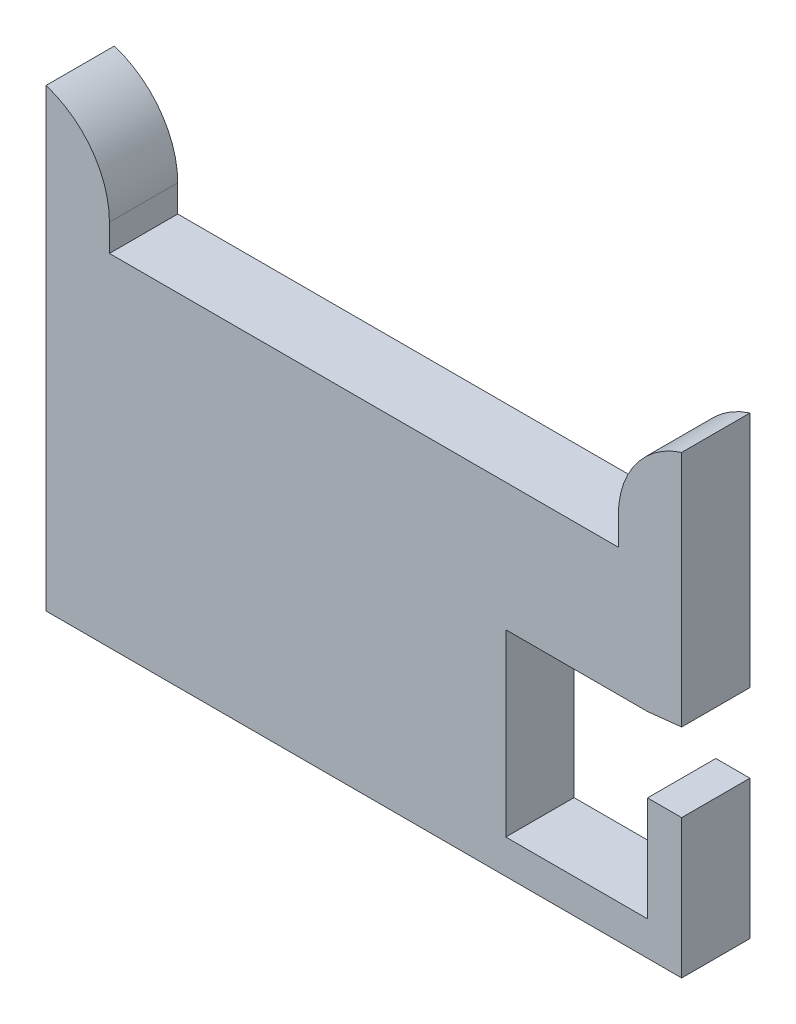
ISO-10303-21;
HEADER;
FILE_DESCRIPTION(('STEP AP214'),'2;1');
FILE_NAME('part.step','',(''),(''),'','','');
FILE_SCHEMA(('AUTOMOTIVE_DESIGN { 1 0 10303 214 1 1 1 1 }'));
ENDSEC;
DATA;
#1=APPLICATION_CONTEXT('core data for automotive mechanical design processes');
#2=APPLICATION_PROTOCOL_DEFINITION('international standard','automotive_design',2000,#1);
#3=PRODUCT_CONTEXT('',#1,'mechanical');
#4=PRODUCT('Part','Part','',(#3));
#5=PRODUCT_RELATED_PRODUCT_CATEGORY('part','',(#4));
#6=PRODUCT_DEFINITION_FORMATION('','',#4);
#7=PRODUCT_DEFINITION_CONTEXT('part definition',#1,'design');
#8=PRODUCT_DEFINITION('design','',#6,#7);
#9=PRODUCT_DEFINITION_SHAPE('','',#8);
#10=(LENGTH_UNIT() NAMED_UNIT(*) SI_UNIT(.MILLI.,.METRE.));
#11=(NAMED_UNIT(*) PLANE_ANGLE_UNIT() SI_UNIT($,.RADIAN.));
#12=(NAMED_UNIT(*) SI_UNIT($,.STERADIAN.) SOLID_ANGLE_UNIT());
#13=UNCERTAINTY_MEASURE_WITH_UNIT(LENGTH_MEASURE(1.E-05),#10,'distance_accuracy_value','');
#14=(GEOMETRIC_REPRESENTATION_CONTEXT(3) GLOBAL_UNCERTAINTY_ASSIGNED_CONTEXT((#13)) GLOBAL_UNIT_ASSIGNED_CONTEXT((#10,
#11,#12)) REPRESENTATION_CONTEXT('',''));
#15=CARTESIAN_POINT('',(0.,0.,0.));
#16=DIRECTION('',(0.,0.,1.));
#17=DIRECTION('',(1.,0.,0.));
#18=AXIS2_PLACEMENT_3D('',#15,#16,#17);
#19=CARTESIAN_POINT('',(27.9278685437168,-36.6169154228856,6.));
#20=DIRECTION('',(-1.,0.,0.));
#21=DIRECTION('',(0.,0.,1.));
#22=AXIS2_PLACEMENT_3D('',#19,#20,#21);
#23=PLANE('',#22);
#24=DIRECTION('',(0.,0.,-1.));
#25=VECTOR('',#24,1.);
#26=CARTESIAN_POINT('',(27.9278685437168,-24.4102266627806,99.7034599579363));
#27=LINE('',#26,#25);
#28=CARTESIAN_POINT('',(27.9278685437168,-24.4102266627806,6.00000000000001));
#29=VERTEX_POINT('',#28);
#30=CARTESIAN_POINT('',(27.9278685437168,-24.4102266627806,0.));
#31=VERTEX_POINT('',#30);
#32=EDGE_CURVE('E55',#29,#31,#27,.T.);
#33=ORIENTED_EDGE('',*,*,#32,.F.);
#34=DIRECTION('',(0.,1.,0.));
#35=VECTOR('',#34,1.);
#36=CARTESIAN_POINT('',(27.9278685437168,-36.6169154228856,6.));
#37=LINE('',#36,#35);
#38=CARTESIAN_POINT('',(27.9278685437168,-36.6169154228856,6.));
#39=VERTEX_POINT('',#38);
#40=EDGE_CURVE('E174',#39,#29,#37,.T.);
#41=ORIENTED_EDGE('',*,*,#40,.F.);
#42=DIRECTION('',(0.,0.,-1.));
#43=VECTOR('',#42,1.);
#44=CARTESIAN_POINT('',(27.9278685437168,-36.6169154228856,6.));
#45=LINE('',#44,#43);
#46=CARTESIAN_POINT('',(27.9278685437168,-36.6169154228856,0.));
#47=VERTEX_POINT('',#46);
#48=EDGE_CURVE('E231',#39,#47,#45,.T.);
#49=ORIENTED_EDGE('',*,*,#48,.T.);
#50=DIRECTION('',(0.,1.,0.));
#51=VECTOR('',#50,1.);
#52=CARTESIAN_POINT('',(27.9278685437168,-36.6169154228856,0.));
#53=LINE('',#52,#51);
#54=EDGE_CURVE('E204',#47,#31,#53,.T.);
#55=ORIENTED_EDGE('',*,*,#54,.T.);
#56=EDGE_LOOP('',(#33,#41,#49,#55));
#57=FACE_BOUND('',#56,.T.);
#58=ADVANCED_FACE('F39',(#57),#23,.F.);
#59=CARTESIAN_POINT('',(0.,0.,6.));
#60=DIRECTION('',(0.,0.,-1.));
#61=DIRECTION('',(-1.,0.,0.));
#62=AXIS2_PLACEMENT_3D('',#59,#60,#61);
#63=PLANE('',#62);
#64=DIRECTION('',(1.,0.,0.));
#65=VECTOR('',#64,1.);
#66=CARTESIAN_POINT('',(0.,-24.4102266627806,6.));
#67=LINE('',#66,#65);
#68=CARTESIAN_POINT('',(24.9278685437168,-24.4102266627806,6.00000000000001));
#69=VERTEX_POINT('',#68);
#70=EDGE_CURVE('E167',#69,#29,#67,.T.);
#71=ORIENTED_EDGE('',*,*,#70,.F.);
#72=DIRECTION('',(0.,1.,0.));
#73=VECTOR('',#72,1.);
#74=CARTESIAN_POINT('',(24.9278685437168,-17.8382437333653,6.));
#75=LINE('',#74,#73);
#76=CARTESIAN_POINT('',(24.9278685437168,-33.6169154228856,6.));
#77=VERTEX_POINT('',#76);
#78=EDGE_CURVE('E283',#77,#69,#75,.T.);
#79=ORIENTED_EDGE('',*,*,#78,.F.);
#80=DIRECTION('',(1.,0.,0.));
#81=VECTOR('',#80,1.);
#82=CARTESIAN_POINT('',(12.4710296326959,-33.6169154228856,6.));
#83=LINE('',#82,#81);
#84=CARTESIAN_POINT('',(12.4710296326959,-33.6169154228856,6.));
#85=VERTEX_POINT('',#84);
#86=EDGE_CURVE('E276',#85,#77,#83,.T.);
#87=ORIENTED_EDGE('',*,*,#86,.F.);
#88=DIRECTION('',(0.,-1.,0.));
#89=VECTOR('',#88,1.);
#90=CARTESIAN_POINT('',(12.4710296326959,-17.8382437333653,6.));
#91=LINE('',#90,#89);
#92=CARTESIAN_POINT('',(12.4710296326959,-17.8382437333653,6.));
#93=VERTEX_POINT('',#92);
#94=EDGE_CURVE('E289',#93,#85,#91,.T.);
#95=ORIENTED_EDGE('',*,*,#94,.F.);
#96=DIRECTION('',(-1.,0.,0.));
#97=VECTOR('',#96,1.);
#98=CARTESIAN_POINT('',(12.4710296326959,-17.8382437333653,6.));
#99=LINE('',#98,#97);
#100=CARTESIAN_POINT('',(24.9278685437168,-17.8382437333653,6.00000000000001));
#101=VERTEX_POINT('',#100);
#102=EDGE_CURVE('E165',#101,#93,#99,.T.);
#103=ORIENTED_EDGE('',*,*,#102,.F.);
#104=DIRECTION('',(-0.994313876279329,-0.10648903905274,0.));
#105=VECTOR('',#104,1.);
#106=CARTESIAN_POINT('',(2.17145612259514,-20.2754102547468,6.));
#107=LINE('',#106,#105);
#108=CARTESIAN_POINT('',(27.9278685437168,-17.5169496985745,6.00000000000001));
#109=VERTEX_POINT('',#108);
#110=EDGE_CURVE('E148',#109,#101,#107,.T.);
#111=ORIENTED_EDGE('',*,*,#110,.F.);
#112=CARTESIAN_POINT('',(27.9278685437168,3.38308457711443,6.));
#113=VERTEX_POINT('',#112);
#114=EDGE_CURVE('E161',#109,#113,#37,.T.);
#115=ORIENTED_EDGE('',*,*,#114,.T.);
#116=CARTESIAN_POINT('',(30.3557292402342,-4.23961130021834,6.));
#117=DIRECTION('',(0.,0.,-1.));
#118=DIRECTION('',(-1.,0.,0.));
#119=AXIS2_PLACEMENT_3D('',#116,#117,#118);
#120=CIRCLE('',#119,8.);
#121=CARTESIAN_POINT('',(22.3557292402342,-4.23961130021835,6.));
#122=VERTEX_POINT('',#121);
#123=EDGE_CURVE('E256',#113,#122,#120,.F.);
#124=ORIENTED_EDGE('',*,*,#123,.T.);
#125=DIRECTION('',(0.,-1.,0.));
#126=VECTOR('',#125,1.);
#127=CARTESIAN_POINT('',(22.3557292402341,3.38308457711443,6.));
#128=LINE('',#127,#126);
#129=CARTESIAN_POINT('',(22.3557292402342,-6.61691542288557,6.));
#130=VERTEX_POINT('',#129);
#131=EDGE_CURVE('E180',#122,#130,#128,.T.);
#132=ORIENTED_EDGE('',*,*,#131,.T.);
#133=DIRECTION('',(-1.,0.,0.));
#134=VECTOR('',#133,1.);
#135=CARTESIAN_POINT('',(22.3557292402342,-6.61691542288557,6.));
#136=LINE('',#135,#134);
#137=CARTESIAN_POINT('',(-22.3557292402341,-6.61691542288557,6.));
#138=VERTEX_POINT('',#137);
#139=EDGE_CURVE('E187',#130,#138,#136,.T.);
#140=ORIENTED_EDGE('',*,*,#139,.T.);
#141=DIRECTION('',(0.,1.,0.));
#142=VECTOR('',#141,1.);
#143=CARTESIAN_POINT('',(-22.3557292402341,3.38308457711443,6.));
#144=LINE('',#143,#142);
#145=CARTESIAN_POINT('',(-22.3557292402341,-4.23961130021835,6.));
#146=VERTEX_POINT('',#145);
#147=EDGE_CURVE('E190',#138,#146,#144,.T.);
#148=ORIENTED_EDGE('',*,*,#147,.T.);
#149=CARTESIAN_POINT('',(-30.3557292402341,-4.23961130021835,6.));
#150=DIRECTION('',(0.,0.,-1.));
#151=DIRECTION('',(-1.,0.,0.));
#152=AXIS2_PLACEMENT_3D('',#149,#150,#151);
#153=CIRCLE('',#152,8.);
#154=CARTESIAN_POINT('',(-27.9278685437168,3.38308457711443,6.));
#155=VERTEX_POINT('',#154);
#156=EDGE_CURVE('E245',#146,#155,#153,.F.);
#157=ORIENTED_EDGE('',*,*,#156,.T.);
#158=DIRECTION('',(0.,-1.,0.));
#159=VECTOR('',#158,1.);
#160=CARTESIAN_POINT('',(-27.9278685437168,-36.6169154228856,6.));
#161=LINE('',#160,#159);
#162=CARTESIAN_POINT('',(-27.9278685437168,-36.6169154228856,6.));
#163=VERTEX_POINT('',#162);
#164=EDGE_CURVE('E181',#155,#163,#161,.T.);
#165=ORIENTED_EDGE('',*,*,#164,.T.);
#166=DIRECTION('',(1.,0.,0.));
#167=VECTOR('',#166,1.);
#168=CARTESIAN_POINT('',(-27.9278685437168,-36.6169154228856,6.));
#169=LINE('',#168,#167);
#170=EDGE_CURVE('E175',#163,#39,#169,.T.);
#171=ORIENTED_EDGE('',*,*,#170,.T.);
#172=ORIENTED_EDGE('',*,*,#40,.T.);
#173=EDGE_LOOP('',(#71,#79,#87,#95,#103,#111,#115,#124,#132,#140,#148,#157,#165,#171,#172));
#174=FACE_BOUND('',#173,.T.);
#175=ADVANCED_FACE('F160',(#174),#63,.F.);
#176=CARTESIAN_POINT('',(0.,0.,0.));
#177=DIRECTION('',(0.,0.,-1.));
#178=DIRECTION('',(-1.,0.,0.));
#179=AXIS2_PLACEMENT_3D('',#176,#177,#178);
#180=PLANE('',#179);
#181=DIRECTION('',(0.,1.,0.));
#182=VECTOR('',#181,1.);
#183=CARTESIAN_POINT('',(24.9278685437168,-17.8382437333653,0.));
#184=LINE('',#183,#182);
#185=CARTESIAN_POINT('',(24.9278685437168,-33.6169154228856,0.));
#186=VERTEX_POINT('',#185);
#187=CARTESIAN_POINT('',(24.9278685437168,-24.4102266627806,0.));
#188=VERTEX_POINT('',#187);
#189=EDGE_CURVE('E270',#186,#188,#184,.T.);
#190=ORIENTED_EDGE('',*,*,#189,.T.);
#191=DIRECTION('',(1.,0.,0.));
#192=VECTOR('',#191,1.);
#193=CARTESIAN_POINT('',(0.,-24.4102266627806,0.));
#194=LINE('',#193,#192);
#195=EDGE_CURVE('E11',#188,#31,#194,.T.);
#196=ORIENTED_EDGE('',*,*,#195,.T.);
#197=ORIENTED_EDGE('',*,*,#54,.F.);
#198=DIRECTION('',(1.,0.,0.));
#199=VECTOR('',#198,1.);
#200=CARTESIAN_POINT('',(-27.9278685437168,-36.6169154228856,0.));
#201=LINE('',#200,#199);
#202=CARTESIAN_POINT('',(-27.9278685437168,-36.6169154228856,0.));
#203=VERTEX_POINT('',#202);
#204=EDGE_CURVE('E199',#203,#47,#201,.T.);
#205=ORIENTED_EDGE('',*,*,#204,.F.);
#206=DIRECTION('',(0.,-1.,0.));
#207=VECTOR('',#206,1.);
#208=CARTESIAN_POINT('',(-27.9278685437168,-36.6169154228856,0.));
#209=LINE('',#208,#207);
#210=CARTESIAN_POINT('',(-27.9278685437168,3.38308457711443,0.));
#211=VERTEX_POINT('',#210);
#212=EDGE_CURVE('E195',#211,#203,#209,.T.);
#213=ORIENTED_EDGE('',*,*,#212,.F.);
#214=CARTESIAN_POINT('',(-30.3557292402341,-4.23961130021835,0.));
#215=DIRECTION('',(0.,0.,-1.));
#216=DIRECTION('',(-1.,0.,0.));
#217=AXIS2_PLACEMENT_3D('',#214,#215,#216);
#218=CIRCLE('',#217,8.);
#219=CARTESIAN_POINT('',(-22.3557292402341,-4.23961130021835,0.));
#220=VERTEX_POINT('',#219);
#221=EDGE_CURVE('E239',#211,#220,#218,.T.);
#222=ORIENTED_EDGE('',*,*,#221,.T.);
#223=DIRECTION('',(0.,1.,0.));
#224=VECTOR('',#223,1.);
#225=CARTESIAN_POINT('',(-22.3557292402341,3.38308457711443,0.));
#226=LINE('',#225,#224);
#227=CARTESIAN_POINT('',(-22.3557292402341,-6.61691542288557,0.));
#228=VERTEX_POINT('',#227);
#229=EDGE_CURVE('E214',#228,#220,#226,.T.);
#230=ORIENTED_EDGE('',*,*,#229,.F.);
#231=DIRECTION('',(-1.,0.,0.));
#232=VECTOR('',#231,1.);
#233=CARTESIAN_POINT('',(22.3557292402342,-6.61691542288557,0.));
#234=LINE('',#233,#232);
#235=CARTESIAN_POINT('',(22.3557292402342,-6.61691542288557,0.));
#236=VERTEX_POINT('',#235);
#237=EDGE_CURVE('E211',#236,#228,#234,.T.);
#238=ORIENTED_EDGE('',*,*,#237,.F.);
#239=DIRECTION('',(0.,-1.,0.));
#240=VECTOR('',#239,1.);
#241=CARTESIAN_POINT('',(22.3557292402341,3.38308457711443,0.));
#242=LINE('',#241,#240);
#243=CARTESIAN_POINT('',(22.3557292402342,-4.23961130021835,0.));
#244=VERTEX_POINT('',#243);
#245=EDGE_CURVE('E208',#244,#236,#242,.T.);
#246=ORIENTED_EDGE('',*,*,#245,.F.);
#247=CARTESIAN_POINT('',(30.3557292402342,-4.23961130021834,0.));
#248=DIRECTION('',(0.,0.,-1.));
#249=DIRECTION('',(-1.,0.,0.));
#250=AXIS2_PLACEMENT_3D('',#247,#248,#249);
#251=CIRCLE('',#250,8.);
#252=CARTESIAN_POINT('',(27.9278685437168,3.38308457711443,0.));
#253=VERTEX_POINT('',#252);
#254=EDGE_CURVE('E252',#244,#253,#251,.T.);
#255=ORIENTED_EDGE('',*,*,#254,.T.);
#256=CARTESIAN_POINT('',(27.9278685437168,-17.5169496985745,0.));
#257=VERTEX_POINT('',#256);
#258=EDGE_CURVE('E203',#257,#253,#53,.T.);
#259=ORIENTED_EDGE('',*,*,#258,.F.);
#260=DIRECTION('',(-0.994313876279329,-0.10648903905274,0.));
#261=VECTOR('',#260,1.);
#262=CARTESIAN_POINT('',(2.17145612259514,-20.2754102547468,0.));
#263=LINE('',#262,#261);
#264=CARTESIAN_POINT('',(24.9278685437168,-17.8382437333653,0.));
#265=VERTEX_POINT('',#264);
#266=EDGE_CURVE('E48',#257,#265,#263,.T.);
#267=ORIENTED_EDGE('',*,*,#266,.T.);
#268=DIRECTION('',(-1.,0.,0.));
#269=VECTOR('',#268,1.);
#270=CARTESIAN_POINT('',(12.4710296326959,-17.8382437333653,0.));
#271=LINE('',#270,#269);
#272=CARTESIAN_POINT('',(12.4710296326959,-17.8382437333653,0.));
#273=VERTEX_POINT('',#272);
#274=EDGE_CURVE('E264',#265,#273,#271,.T.);
#275=ORIENTED_EDGE('',*,*,#274,.T.);
#276=DIRECTION('',(0.,-1.,0.));
#277=VECTOR('',#276,1.);
#278=CARTESIAN_POINT('',(12.4710296326959,-17.8382437333653,0.));
#279=LINE('',#278,#277);
#280=CARTESIAN_POINT('',(12.4710296326959,-33.6169154228856,0.));
#281=VERTEX_POINT('',#280);
#282=EDGE_CURVE('E62',#273,#281,#279,.T.);
#283=ORIENTED_EDGE('',*,*,#282,.T.);
#284=DIRECTION('',(1.,0.,0.));
#285=VECTOR('',#284,1.);
#286=CARTESIAN_POINT('',(12.4710296326959,-33.6169154228856,0.));
#287=LINE('',#286,#285);
#288=EDGE_CURVE('E274',#281,#186,#287,.T.);
#289=ORIENTED_EDGE('',*,*,#288,.T.);
#290=EDGE_LOOP('',(#190,#196,#197,#205,#213,#222,#230,#238,#246,#255,#259,#267,#275,#283,#289));
#291=FACE_BOUND('',#290,.T.);
#292=ADVANCED_FACE('F263',(#291),#180,.T.);
#293=CARTESIAN_POINT('',(-27.9278685437168,-36.6169154228856,6.));
#294=DIRECTION('',(1.,0.,0.));
#295=DIRECTION('',(0.,0.,-1.));
#296=AXIS2_PLACEMENT_3D('',#293,#294,#295);
#297=PLANE('',#296);
#298=ORIENTED_EDGE('',*,*,#212,.T.);
#299=DIRECTION('',(0.,0.,-1.));
#300=VECTOR('',#299,1.);
#301=CARTESIAN_POINT('',(-27.9278685437168,-36.6169154228856,6.));
#302=LINE('',#301,#300);
#303=EDGE_CURVE('E235',#163,#203,#302,.T.);
#304=ORIENTED_EDGE('',*,*,#303,.F.);
#305=ORIENTED_EDGE('',*,*,#164,.F.);
#306=DIRECTION('',(0.,0.,-1.));
#307=VECTOR('',#306,1.);
#308=CARTESIAN_POINT('',(-27.9278685437168,3.38308457711443,6.));
#309=LINE('',#308,#307);
#310=EDGE_CURVE('E194',#155,#211,#309,.T.);
#311=ORIENTED_EDGE('',*,*,#310,.T.);
#312=EDGE_LOOP('',(#298,#304,#305,#311));
#313=FACE_BOUND('',#312,.T.);
#314=ADVANCED_FACE('F312',(#313),#297,.F.);
#315=CARTESIAN_POINT('',(-27.9278685437168,-36.6169154228856,6.));
#316=DIRECTION('',(0.,1.,0.));
#317=DIRECTION('',(0.,0.,1.));
#318=AXIS2_PLACEMENT_3D('',#315,#316,#317);
#319=PLANE('',#318);
#320=ORIENTED_EDGE('',*,*,#204,.T.);
#321=ORIENTED_EDGE('',*,*,#48,.F.);
#322=ORIENTED_EDGE('',*,*,#170,.F.);
#323=ORIENTED_EDGE('',*,*,#303,.T.);
#324=EDGE_LOOP('',(#320,#321,#322,#323));
#325=FACE_BOUND('',#324,.T.);
#326=ADVANCED_FACE('F315',(#325),#319,.F.);
#327=ORIENTED_EDGE('',*,*,#114,.F.);
#328=DIRECTION('',(0.,0.,-1.));
#329=VECTOR('',#328,1.);
#330=CARTESIAN_POINT('',(27.9278685437168,-17.5169496985745,99.7034599579363));
#331=LINE('',#330,#329);
#332=EDGE_CURVE('E145',#109,#257,#331,.T.);
#333=ORIENTED_EDGE('',*,*,#332,.T.);
#334=ORIENTED_EDGE('',*,*,#258,.T.);
#335=DIRECTION('',(0.,0.,-1.));
#336=VECTOR('',#335,1.);
#337=CARTESIAN_POINT('',(27.9278685437168,3.38308457711443,6.));
#338=LINE('',#337,#336);
#339=EDGE_CURVE('E171',#113,#253,#338,.T.);
#340=ORIENTED_EDGE('',*,*,#339,.F.);
#341=EDGE_LOOP('',(#327,#333,#334,#340));
#342=FACE_BOUND('',#341,.T.);
#343=ADVANCED_FACE('F169',(#342),#23,.F.);
#344=CARTESIAN_POINT('',(22.3557292402341,3.38308457711443,6.));
#345=DIRECTION('',(1.,0.,0.));
#346=DIRECTION('',(0.,1.,0.));
#347=AXIS2_PLACEMENT_3D('',#344,#345,#346);
#348=PLANE('',#347);
#349=ORIENTED_EDGE('',*,*,#131,.F.);
#350=DIRECTION('',(0.,0.,-1.));
#351=VECTOR('',#350,1.);
#352=CARTESIAN_POINT('',(22.3557292402342,-4.23961130021835,6.));
#353=LINE('',#352,#351);
#354=EDGE_CURVE('E248',#122,#244,#353,.T.);
#355=ORIENTED_EDGE('',*,*,#354,.T.);
#356=ORIENTED_EDGE('',*,*,#245,.T.);
#357=DIRECTION('',(0.,0.,-1.));
#358=VECTOR('',#357,1.);
#359=CARTESIAN_POINT('',(22.3557292402342,-6.61691542288557,6.));
#360=LINE('',#359,#358);
#361=EDGE_CURVE('E225',#130,#236,#360,.T.);
#362=ORIENTED_EDGE('',*,*,#361,.F.);
#363=EDGE_LOOP('',(#349,#355,#356,#362));
#364=FACE_BOUND('',#363,.T.);
#365=ADVANCED_FACE('F351',(#364),#348,.F.);
#366=CARTESIAN_POINT('',(22.3557292402342,-6.61691542288557,6.));
#367=DIRECTION('',(0.,-1.,0.));
#368=DIRECTION('',(1.,0.,0.));
#369=AXIS2_PLACEMENT_3D('',#366,#367,#368);
#370=PLANE('',#369);
#371=ORIENTED_EDGE('',*,*,#237,.T.);
#372=DIRECTION('',(0.,0.,-1.));
#373=VECTOR('',#372,1.);
#374=CARTESIAN_POINT('',(-22.3557292402341,-6.61691542288557,6.));
#375=LINE('',#374,#373);
#376=EDGE_CURVE('E221',#138,#228,#375,.T.);
#377=ORIENTED_EDGE('',*,*,#376,.F.);
#378=ORIENTED_EDGE('',*,*,#139,.F.);
#379=ORIENTED_EDGE('',*,*,#361,.T.);
#380=EDGE_LOOP('',(#371,#377,#378,#379));
#381=FACE_BOUND('',#380,.T.);
#382=ADVANCED_FACE('F356',(#381),#370,.F.);
#383=CARTESIAN_POINT('',(-22.3557292402341,3.38308457711443,6.));
#384=DIRECTION('',(-1.,0.,0.));
#385=DIRECTION('',(0.,0.,1.));
#386=AXIS2_PLACEMENT_3D('',#383,#384,#385);
#387=PLANE('',#386);
#388=ORIENTED_EDGE('',*,*,#229,.T.);
#389=DIRECTION('',(0.,0.,1.));
#390=VECTOR('',#389,1.);
#391=CARTESIAN_POINT('',(-22.3557292402341,-4.23961130021835,6.));
#392=LINE('',#391,#390);
#393=EDGE_CURVE('E242',#220,#146,#392,.T.);
#394=ORIENTED_EDGE('',*,*,#393,.T.);
#395=ORIENTED_EDGE('',*,*,#147,.F.);
#396=ORIENTED_EDGE('',*,*,#376,.T.);
#397=EDGE_LOOP('',(#388,#394,#395,#396));
#398=FACE_BOUND('',#397,.T.);
#399=ADVANCED_FACE('F364',(#398),#387,.F.);
#400=CARTESIAN_POINT('',(-30.3557292402341,-4.23961130021835,6.));
#401=DIRECTION('',(0.,0.,1.));
#402=DIRECTION('',(1.,0.,0.));
#403=AXIS2_PLACEMENT_3D('',#400,#401,#402);
#404=CYLINDRICAL_SURFACE('',#403,8.);
#405=ORIENTED_EDGE('',*,*,#156,.F.);
#406=ORIENTED_EDGE('',*,*,#393,.F.);
#407=ORIENTED_EDGE('',*,*,#221,.F.);
#408=ORIENTED_EDGE('',*,*,#310,.F.);
#409=EDGE_LOOP('',(#405,#406,#407,#408));
#410=FACE_BOUND('',#409,.T.);
#411=ADVANCED_FACE('F362',(#410),#404,.T.);
#412=CARTESIAN_POINT('',(30.3557292402342,-4.23961130021834,6.));
#413=DIRECTION('',(0.,0.,-1.));
#414=DIRECTION('',(-1.,0.,0.));
#415=AXIS2_PLACEMENT_3D('',#412,#413,#414);
#416=CYLINDRICAL_SURFACE('',#415,8.);
#417=ORIENTED_EDGE('',*,*,#123,.F.);
#418=ORIENTED_EDGE('',*,*,#339,.T.);
#419=ORIENTED_EDGE('',*,*,#254,.F.);
#420=ORIENTED_EDGE('',*,*,#354,.F.);
#421=EDGE_LOOP('',(#417,#418,#419,#420));
#422=FACE_BOUND('',#421,.T.);
#423=ADVANCED_FACE('F41',(#422),#416,.T.);
#424=CARTESIAN_POINT('',(24.9278685437168,-17.8382437333653,0.));
#425=DIRECTION('',(1.,0.,0.));
#426=DIRECTION('',(0.,0.,-1.));
#427=AXIS2_PLACEMENT_3D('',#424,#425,#426);
#428=PLANE('',#427);
#429=ORIENTED_EDGE('',*,*,#78,.T.);
#430=DIRECTION('',(0.,0.,-1.));
#431=VECTOR('',#430,1.);
#432=CARTESIAN_POINT('',(24.9278685437168,-24.4102266627806,99.7034599579363));
#433=LINE('',#432,#431);
#434=EDGE_CURVE('E155',#69,#188,#433,.T.);
#435=ORIENTED_EDGE('',*,*,#434,.T.);
#436=ORIENTED_EDGE('',*,*,#189,.F.);
#437=DIRECTION('',(0.,0.,1.));
#438=VECTOR('',#437,1.);
#439=CARTESIAN_POINT('',(24.9278685437168,-33.6169154228856,0.));
#440=LINE('',#439,#438);
#441=EDGE_CURVE('E200',#186,#77,#440,.T.);
#442=ORIENTED_EDGE('',*,*,#441,.T.);
#443=EDGE_LOOP('',(#429,#435,#436,#442));
#444=FACE_BOUND('',#443,.T.);
#445=ADVANCED_FACE('F324',(#444),#428,.F.);
#446=CARTESIAN_POINT('',(12.4710296326959,-33.6169154228856,0.));
#447=DIRECTION('',(0.,-1.,0.));
#448=DIRECTION('',(0.,0.,-1.));
#449=AXIS2_PLACEMENT_3D('',#446,#447,#448);
#450=PLANE('',#449);
#451=ORIENTED_EDGE('',*,*,#86,.T.);
#452=ORIENTED_EDGE('',*,*,#441,.F.);
#453=ORIENTED_EDGE('',*,*,#288,.F.);
#454=DIRECTION('',(0.,0.,1.));
#455=VECTOR('',#454,1.);
#456=CARTESIAN_POINT('',(12.4710296326959,-33.6169154228856,0.));
#457=LINE('',#456,#455);
#458=EDGE_CURVE('E298',#281,#85,#457,.T.);
#459=ORIENTED_EDGE('',*,*,#458,.T.);
#460=EDGE_LOOP('',(#451,#452,#453,#459));
#461=FACE_BOUND('',#460,.T.);
#462=ADVANCED_FACE('F328',(#461),#450,.F.);
#463=CARTESIAN_POINT('',(12.4710296326959,-17.8382437333653,0.));
#464=DIRECTION('',(-1.,0.,0.));
#465=DIRECTION('',(0.,-1.,0.));
#466=AXIS2_PLACEMENT_3D('',#463,#464,#465);
#467=PLANE('',#466);
#468=ORIENTED_EDGE('',*,*,#94,.T.);
#469=ORIENTED_EDGE('',*,*,#458,.F.);
#470=ORIENTED_EDGE('',*,*,#282,.F.);
#471=DIRECTION('',(0.,0.,1.));
#472=VECTOR('',#471,1.);
#473=CARTESIAN_POINT('',(12.4710296326959,-17.8382437333653,0.));
#474=LINE('',#473,#472);
#475=EDGE_CURVE('E268',#273,#93,#474,.T.);
#476=ORIENTED_EDGE('',*,*,#475,.T.);
#477=EDGE_LOOP('',(#468,#469,#470,#476));
#478=FACE_BOUND('',#477,.T.);
#479=ADVANCED_FACE('F329',(#478),#467,.F.);
#480=CARTESIAN_POINT('',(12.4710296326959,-17.8382437333653,0.));
#481=DIRECTION('',(0.,1.,0.));
#482=DIRECTION('',(0.,0.,1.));
#483=AXIS2_PLACEMENT_3D('',#480,#481,#482);
#484=PLANE('',#483);
#485=ORIENTED_EDGE('',*,*,#102,.T.);
#486=ORIENTED_EDGE('',*,*,#475,.F.);
#487=ORIENTED_EDGE('',*,*,#274,.F.);
#488=DIRECTION('',(0.,0.,1.));
#489=VECTOR('',#488,1.);
#490=CARTESIAN_POINT('',(24.9278685437168,-17.8382437333653,0.));
#491=LINE('',#490,#489);
#492=EDGE_CURVE('E267',#265,#101,#491,.T.);
#493=ORIENTED_EDGE('',*,*,#492,.T.);
#494=EDGE_LOOP('',(#485,#486,#487,#493));
#495=FACE_BOUND('',#494,.T.);
#496=ADVANCED_FACE('F266',(#495),#484,.F.);
#497=CARTESIAN_POINT('',(27.9278685437168,-17.5169496985745,99.7034599579363));
#498=DIRECTION('',(0.10648903905274,-0.994313876279329,0.));
#499=DIRECTION('',(0.994313876279329,0.10648903905274,0.));
#500=AXIS2_PLACEMENT_3D('',#497,#498,#499);
#501=PLANE('',#500);
#502=ORIENTED_EDGE('',*,*,#332,.F.);
#503=ORIENTED_EDGE('',*,*,#110,.T.);
#504=ORIENTED_EDGE('',*,*,#492,.F.);
#505=ORIENTED_EDGE('',*,*,#266,.F.);
#506=EDGE_LOOP('',(#502,#503,#504,#505));
#507=FACE_BOUND('',#506,.T.);
#508=ADVANCED_FACE('F147',(#507),#501,.T.);
#509=CARTESIAN_POINT('',(24.9278685437168,-24.4102266627806,99.7034599579363));
#510=DIRECTION('',(0.,1.,0.));
#511=DIRECTION('',(0.,0.,1.));
#512=AXIS2_PLACEMENT_3D('',#509,#510,#511);
#513=PLANE('',#512);
#514=ORIENTED_EDGE('',*,*,#434,.F.);
#515=ORIENTED_EDGE('',*,*,#70,.T.);
#516=ORIENTED_EDGE('',*,*,#32,.T.);
#517=ORIENTED_EDGE('',*,*,#195,.F.);
#518=EDGE_LOOP('',(#514,#515,#516,#517));
#519=FACE_BOUND('',#518,.T.);
#520=ADVANCED_FACE('F330',(#519),#513,.T.);
#521=CLOSED_SHELL('',(#58,#175,#292,#314,#326,#343,#365,#382,#399,#411,#423,#445,#462,#479,#496,
#508,#520));
#522=MANIFOLD_SOLID_BREP('B2',#521);
#523=ADVANCED_BREP_SHAPE_REPRESENTATION('',(#18,#522),#14);
#524=SHAPE_DEFINITION_REPRESENTATION(#9,#523);
ENDSEC;
END-ISO-10303-21;
